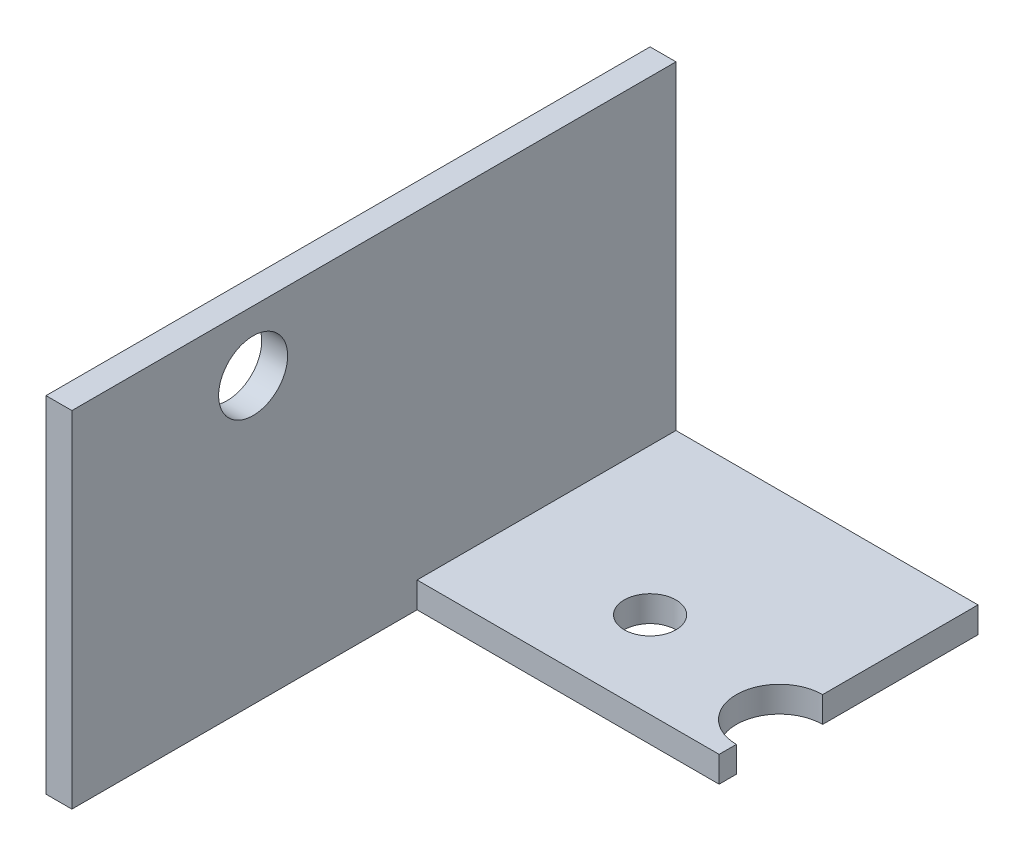
ISO-10303-21;
HEADER;
FILE_DESCRIPTION(('STEP AP214'),'2;1');
FILE_NAME('part.step','',(''),(''),'','','');
FILE_SCHEMA(('AUTOMOTIVE_DESIGN { 1 0 10303 214 1 1 1 1 }'));
ENDSEC;
DATA;
#1=APPLICATION_CONTEXT('core data for automotive mechanical design processes');
#2=APPLICATION_PROTOCOL_DEFINITION('international standard','automotive_design',2000,#1);
#3=PRODUCT_CONTEXT('',#1,'mechanical');
#4=PRODUCT('Part','Part','',(#3));
#5=PRODUCT_RELATED_PRODUCT_CATEGORY('part','',(#4));
#6=PRODUCT_DEFINITION_FORMATION('','',#4);
#7=PRODUCT_DEFINITION_CONTEXT('part definition',#1,'design');
#8=PRODUCT_DEFINITION('design','',#6,#7);
#9=PRODUCT_DEFINITION_SHAPE('','',#8);
#10=(LENGTH_UNIT() NAMED_UNIT(*) SI_UNIT(.MILLI.,.METRE.));
#11=(NAMED_UNIT(*) PLANE_ANGLE_UNIT() SI_UNIT($,.RADIAN.));
#12=(NAMED_UNIT(*) SI_UNIT($,.STERADIAN.) SOLID_ANGLE_UNIT());
#13=UNCERTAINTY_MEASURE_WITH_UNIT(LENGTH_MEASURE(1.E-05),#10,'distance_accuracy_value','');
#14=(GEOMETRIC_REPRESENTATION_CONTEXT(3) GLOBAL_UNCERTAINTY_ASSIGNED_CONTEXT((#13)) GLOBAL_UNIT_ASSIGNED_CONTEXT((#10,
#11,#12)) REPRESENTATION_CONTEXT('',''));
#15=CARTESIAN_POINT('',(0.,0.,0.));
#16=DIRECTION('',(0.,0.,1.));
#17=DIRECTION('',(1.,0.,0.));
#18=AXIS2_PLACEMENT_3D('',#15,#16,#17);
#19=CARTESIAN_POINT('',(5.54541888332214,-10.2268421052632,35.));
#20=DIRECTION('',(-1.,0.,0.));
#21=DIRECTION('',(0.,0.,1.));
#22=AXIS2_PLACEMENT_3D('',#19,#20,#21);
#23=PLANE('',#22);
#24=DIRECTION('',(0.,0.,-1.));
#25=VECTOR('',#24,1.);
#26=CARTESIAN_POINT('',(5.54541888332214,-10.2268421052632,35.));
#27=LINE('',#26,#25);
#28=CARTESIAN_POINT('',(5.54541888332214,-10.2268421052632,15.));
#29=VERTEX_POINT('',#28);
#30=CARTESIAN_POINT('',(5.54541888332214,-10.2268421052632,14.));
#31=VERTEX_POINT('',#30);
#32=EDGE_CURVE('E120',#29,#31,#27,.T.);
#33=ORIENTED_EDGE('',*,*,#32,.T.);
#34=DIRECTION('',(0.,1.,0.));
#35=VECTOR('',#34,1.);
#36=CARTESIAN_POINT('',(5.54541888332214,-25.7268421052632,14.));
#37=LINE('',#36,#35);
#38=CARTESIAN_POINT('',(5.54541888332214,-8.72684210526316,14.));
#39=VERTEX_POINT('',#38);
#40=EDGE_CURVE('E109',#31,#39,#37,.T.);
#41=ORIENTED_EDGE('',*,*,#40,.T.);
#42=DIRECTION('',(0.,0.,-1.));
#43=VECTOR('',#42,1.);
#44=CARTESIAN_POINT('',(5.54541888332214,-8.72684210526316,35.));
#45=LINE('',#44,#43);
#46=CARTESIAN_POINT('',(5.54541888332214,-8.72684210526316,15.));
#47=VERTEX_POINT('',#46);
#48=EDGE_CURVE('E118',#47,#39,#45,.T.);
#49=ORIENTED_EDGE('',*,*,#48,.F.);
#50=DIRECTION('',(0.,1.,0.));
#51=VECTOR('',#50,1.);
#52=CARTESIAN_POINT('',(5.54541888332215,-25.7268421052632,15.));
#53=LINE('',#52,#51);
#54=EDGE_CURVE('E182',#29,#47,#53,.T.);
#55=ORIENTED_EDGE('',*,*,#54,.F.);
#56=EDGE_LOOP('',(#33,#41,#49,#55));
#57=FACE_BOUND('',#56,.T.);
#58=ADVANCED_FACE('F31',(#57),#23,.F.);
#59=CARTESIAN_POINT('',(-11.9545811166779,9.77315789473684,35.));
#60=DIRECTION('',(0.,-1.,0.));
#61=DIRECTION('',(1.,0.,0.));
#62=AXIS2_PLACEMENT_3D('',#59,#60,#61);
#63=PLANE('',#62);
#64=DIRECTION('',(-1.,0.,0.));
#65=VECTOR('',#64,1.);
#66=CARTESIAN_POINT('',(-11.9545811166779,9.77315789473684,0.));
#67=LINE('',#66,#65);
#68=CARTESIAN_POINT('',(-11.9545811166779,9.77315789473684,0.));
#69=VERTEX_POINT('',#68);
#70=CARTESIAN_POINT('',(-13.4545811166779,9.77315789473684,0.));
#71=VERTEX_POINT('',#70);
#72=EDGE_CURVE('E146',#69,#71,#67,.T.);
#73=ORIENTED_EDGE('',*,*,#72,.T.);
#74=DIRECTION('',(0.,0.,-1.));
#75=VECTOR('',#74,1.);
#76=CARTESIAN_POINT('',(-13.4545811166779,9.77315789473684,35.));
#77=LINE('',#76,#75);
#78=CARTESIAN_POINT('',(-13.4545811166779,9.77315789473684,35.));
#79=VERTEX_POINT('',#78);
#80=EDGE_CURVE('E39',#79,#71,#77,.T.);
#81=ORIENTED_EDGE('',*,*,#80,.F.);
#82=DIRECTION('',(-1.,0.,0.));
#83=VECTOR('',#82,1.);
#84=CARTESIAN_POINT('',(-11.9545811166779,9.77315789473684,35.));
#85=LINE('',#84,#83);
#86=CARTESIAN_POINT('',(-11.9545811166779,9.77315789473684,35.));
#87=VERTEX_POINT('',#86);
#88=EDGE_CURVE('E167',#87,#79,#85,.T.);
#89=ORIENTED_EDGE('',*,*,#88,.F.);
#90=DIRECTION('',(0.,0.,-1.));
#91=VECTOR('',#90,1.);
#92=CARTESIAN_POINT('',(-11.9545811166779,9.77315789473684,35.));
#93=LINE('',#92,#91);
#94=EDGE_CURVE('E147',#87,#69,#93,.T.);
#95=ORIENTED_EDGE('',*,*,#94,.T.);
#96=EDGE_LOOP('',(#73,#81,#89,#95));
#97=FACE_BOUND('',#96,.T.);
#98=ADVANCED_FACE('F33',(#97),#63,.F.);
#99=CARTESIAN_POINT('',(-13.4545811166779,9.77315789473684,35.));
#100=DIRECTION('',(1.,0.,0.));
#101=DIRECTION('',(0.,1.,0.));
#102=AXIS2_PLACEMENT_3D('',#99,#100,#101);
#103=PLANE('',#102);
#104=CARTESIAN_POINT('',(-13.4545811166779,6.27315789473685,24.5));
#105=DIRECTION('',(1.,0.,0.));
#106=DIRECTION('',(0.,1.,0.));
#107=AXIS2_PLACEMENT_3D('',#104,#105,#106);
#108=CIRCLE('',#107,2.);
#109=CARTESIAN_POINT('',(-13.4545811166779,8.27315789473685,24.5));
#110=VERTEX_POINT('',#109);
#111=EDGE_CURVE('E149',#110,#110,#108,.T.);
#112=ORIENTED_EDGE('',*,*,#111,.T.);
#113=EDGE_LOOP('',(#112));
#114=FACE_BOUND('',#113,.T.);
#115=DIRECTION('',(0.,-1.,0.));
#116=VECTOR('',#115,1.);
#117=CARTESIAN_POINT('',(-13.4545811166779,9.77315789473684,0.));
#118=LINE('',#117,#116);
#119=CARTESIAN_POINT('',(-13.4545811166779,-10.2268421052632,0.));
#120=VERTEX_POINT('',#119);
#121=EDGE_CURVE('E142',#71,#120,#118,.T.);
#122=ORIENTED_EDGE('',*,*,#121,.T.);
#123=DIRECTION('',(0.,0.,-1.));
#124=VECTOR('',#123,1.);
#125=CARTESIAN_POINT('',(-13.4545811166779,-10.2268421052632,35.));
#126=LINE('',#125,#124);
#127=CARTESIAN_POINT('',(-13.4545811166779,-10.2268421052632,35.));
#128=VERTEX_POINT('',#127);
#129=EDGE_CURVE('E137',#128,#120,#126,.T.);
#130=ORIENTED_EDGE('',*,*,#129,.F.);
#131=DIRECTION('',(0.,-1.,0.));
#132=VECTOR('',#131,1.);
#133=CARTESIAN_POINT('',(-13.4545811166779,9.77315789473684,35.));
#134=LINE('',#133,#132);
#135=EDGE_CURVE('E86',#79,#128,#134,.T.);
#136=ORIENTED_EDGE('',*,*,#135,.F.);
#137=ORIENTED_EDGE('',*,*,#80,.T.);
#138=EDGE_LOOP('',(#122,#130,#136,#137));
#139=FACE_BOUND('',#138,.T.);
#140=ADVANCED_FACE('F141',(#114,#139),#103,.F.);
#141=CARTESIAN_POINT('',(-13.4545811166779,-10.2268421052632,35.));
#142=DIRECTION('',(0.,1.,0.));
#143=DIRECTION('',(0.,0.,1.));
#144=AXIS2_PLACEMENT_3D('',#141,#142,#143);
#145=PLANE('',#144);
#146=CARTESIAN_POINT('',(-3.45458111667786,-10.2268421052632,10.));
#147=DIRECTION('',(0.,1.,0.));
#148=DIRECTION('',(0.,0.,1.));
#149=AXIS2_PLACEMENT_3D('',#146,#147,#148);
#150=CIRCLE('',#149,1.5);
#151=CARTESIAN_POINT('',(-3.45458111667786,-10.2268421052632,11.5));
#152=VERTEX_POINT('',#151);
#153=EDGE_CURVE('E186',#152,#152,#150,.T.);
#154=ORIENTED_EDGE('',*,*,#153,.T.);
#155=EDGE_LOOP('',(#154));
#156=FACE_BOUND('',#155,.T.);
#157=CARTESIAN_POINT('',(5.54541888332214,-10.2268421052632,9.));
#158=VERTEX_POINT('',#157);
#159=CARTESIAN_POINT('',(5.54541888332214,-10.2268421052632,0.));
#160=VERTEX_POINT('',#159);
#161=EDGE_CURVE('E129',#158,#160,#27,.T.);
#162=ORIENTED_EDGE('',*,*,#161,.F.);
#163=CARTESIAN_POINT('',(5.54541888332214,-10.2268421052632,11.5));
#164=DIRECTION('',(0.,1.,0.));
#165=DIRECTION('',(0.,0.,1.));
#166=AXIS2_PLACEMENT_3D('',#163,#164,#165);
#167=CIRCLE('',#166,2.5);
#168=EDGE_CURVE('E122',#158,#31,#167,.T.);
#169=ORIENTED_EDGE('',*,*,#168,.T.);
#170=ORIENTED_EDGE('',*,*,#32,.F.);
#171=DIRECTION('',(-1.,0.,0.));
#172=VECTOR('',#171,1.);
#173=CARTESIAN_POINT('',(-13.4545811166779,-10.2268421052632,15.));
#174=LINE('',#173,#172);
#175=CARTESIAN_POINT('',(-11.9545811166779,-10.2268421052632,15.));
#176=VERTEX_POINT('',#175);
#177=EDGE_CURVE('E175',#29,#176,#174,.T.);
#178=ORIENTED_EDGE('',*,*,#177,.T.);
#179=DIRECTION('',(0.,0.,1.));
#180=VECTOR('',#179,1.);
#181=CARTESIAN_POINT('',(-11.9545811166779,-10.2268421052632,35.));
#182=LINE('',#181,#180);
#183=CARTESIAN_POINT('',(-11.9545811166779,-10.2268421052632,35.));
#184=VERTEX_POINT('',#183);
#185=EDGE_CURVE('E178',#176,#184,#182,.T.);
#186=ORIENTED_EDGE('',*,*,#185,.T.);
#187=DIRECTION('',(1.,0.,0.));
#188=VECTOR('',#187,1.);
#189=CARTESIAN_POINT('',(-13.4545811166779,-10.2268421052632,35.));
#190=LINE('',#189,#188);
#191=EDGE_CURVE('E168',#128,#184,#190,.T.);
#192=ORIENTED_EDGE('',*,*,#191,.F.);
#193=ORIENTED_EDGE('',*,*,#129,.T.);
#194=DIRECTION('',(1.,0.,0.));
#195=VECTOR('',#194,1.);
#196=CARTESIAN_POINT('',(-13.4545811166779,-10.2268421052632,0.));
#197=LINE('',#196,#195);
#198=EDGE_CURVE('E151',#120,#160,#197,.T.);
#199=ORIENTED_EDGE('',*,*,#198,.T.);
#200=EDGE_LOOP('',(#162,#169,#170,#178,#186,#192,#193,#199));
#201=FACE_BOUND('',#200,.T.);
#202=ADVANCED_FACE('F196',(#156,#201),#145,.F.);
#203=CARTESIAN_POINT('',(5.54541888332214,-8.72684210526316,9.));
#204=VERTEX_POINT('',#203);
#205=CARTESIAN_POINT('',(5.54541888332214,-8.72684210526316,0.));
#206=VERTEX_POINT('',#205);
#207=EDGE_CURVE('E130',#204,#206,#45,.T.);
#208=ORIENTED_EDGE('',*,*,#207,.F.);
#209=DIRECTION('',(0.,1.,0.));
#210=VECTOR('',#209,1.);
#211=CARTESIAN_POINT('',(5.54541888332214,-25.7268421052632,9.));
#212=LINE('',#211,#210);
#213=EDGE_CURVE('E46',#204,#158,#212,.F.);
#214=ORIENTED_EDGE('',*,*,#213,.T.);
#215=ORIENTED_EDGE('',*,*,#161,.T.);
#216=DIRECTION('',(0.,1.,0.));
#217=VECTOR('',#216,1.);
#218=CARTESIAN_POINT('',(5.54541888332214,-10.2268421052632,0.));
#219=LINE('',#218,#217);
#220=EDGE_CURVE('E161',#160,#206,#219,.T.);
#221=ORIENTED_EDGE('',*,*,#220,.T.);
#222=EDGE_LOOP('',(#208,#214,#215,#221));
#223=FACE_BOUND('',#222,.T.);
#224=ADVANCED_FACE('F194',(#223),#23,.F.);
#225=CARTESIAN_POINT('',(5.54541888332214,-8.72684210526316,35.));
#226=DIRECTION('',(0.,-1.,0.));
#227=DIRECTION('',(1.,0.,0.));
#228=AXIS2_PLACEMENT_3D('',#225,#226,#227);
#229=PLANE('',#228);
#230=CARTESIAN_POINT('',(-3.45458111667786,-8.72684210526316,10.));
#231=DIRECTION('',(0.,1.,0.));
#232=DIRECTION('',(-1.,0.,0.));
#233=AXIS2_PLACEMENT_3D('',#230,#231,#232);
#234=CIRCLE('',#233,1.5);
#235=CARTESIAN_POINT('',(-4.95458111667786,-8.72684210526316,10.));
#236=VERTEX_POINT('',#235);
#237=EDGE_CURVE('E121',#236,#236,#234,.T.);
#238=ORIENTED_EDGE('',*,*,#237,.F.);
#239=EDGE_LOOP('',(#238));
#240=FACE_BOUND('',#239,.T.);
#241=ORIENTED_EDGE('',*,*,#48,.T.);
#242=CARTESIAN_POINT('',(5.54541888332214,-8.72684210526316,11.5));
#243=DIRECTION('',(0.,-1.,0.));
#244=DIRECTION('',(1.,0.,0.));
#245=AXIS2_PLACEMENT_3D('',#242,#243,#244);
#246=CIRCLE('',#245,2.5);
#247=EDGE_CURVE('E11',#39,#204,#246,.T.);
#248=ORIENTED_EDGE('',*,*,#247,.T.);
#249=ORIENTED_EDGE('',*,*,#207,.T.);
#250=DIRECTION('',(-1.,0.,0.));
#251=VECTOR('',#250,1.);
#252=CARTESIAN_POINT('',(5.54541888332214,-8.72684210526316,0.));
#253=LINE('',#252,#251);
#254=CARTESIAN_POINT('',(-11.9545811166779,-8.72684210526316,0.));
#255=VERTEX_POINT('',#254);
#256=EDGE_CURVE('E164',#206,#255,#253,.T.);
#257=ORIENTED_EDGE('',*,*,#256,.T.);
#258=DIRECTION('',(0.,0.,-1.));
#259=VECTOR('',#258,1.);
#260=CARTESIAN_POINT('',(-11.9545811166779,-8.72684210526316,35.));
#261=LINE('',#260,#259);
#262=CARTESIAN_POINT('',(-11.9545811166779,-8.72684210526316,15.));
#263=VERTEX_POINT('',#262);
#264=EDGE_CURVE('E133',#263,#255,#261,.T.);
#265=ORIENTED_EDGE('',*,*,#264,.F.);
#266=DIRECTION('',(-1.,0.,0.));
#267=VECTOR('',#266,1.);
#268=CARTESIAN_POINT('',(5.54541888332214,-8.72684210526316,15.));
#269=LINE('',#268,#267);
#270=EDGE_CURVE('E128',#47,#263,#269,.T.);
#271=ORIENTED_EDGE('',*,*,#270,.F.);
#272=EDGE_LOOP('',(#241,#248,#249,#257,#265,#271));
#273=FACE_BOUND('',#272,.T.);
#274=ADVANCED_FACE('F125',(#240,#273),#229,.F.);
#275=CARTESIAN_POINT('',(-11.9545811166779,-8.72684210526316,35.));
#276=DIRECTION('',(-1.,0.,0.));
#277=DIRECTION('',(0.,-1.,0.));
#278=AXIS2_PLACEMENT_3D('',#275,#276,#277);
#279=PLANE('',#278);
#280=CARTESIAN_POINT('',(-11.9545811166779,6.27315789473685,24.5));
#281=DIRECTION('',(1.,0.,0.));
#282=DIRECTION('',(0.,1.,0.));
#283=AXIS2_PLACEMENT_3D('',#280,#281,#282);
#284=CIRCLE('',#283,2.);
#285=CARTESIAN_POINT('',(-11.9545811166779,8.27315789473685,24.5));
#286=VERTEX_POINT('',#285);
#287=EDGE_CURVE('E154',#286,#286,#284,.T.);
#288=ORIENTED_EDGE('',*,*,#287,.F.);
#289=EDGE_LOOP('',(#288));
#290=FACE_BOUND('',#289,.T.);
#291=DIRECTION('',(0.,1.,0.));
#292=VECTOR('',#291,1.);
#293=CARTESIAN_POINT('',(-11.9545811166779,-8.72684210526316,0.));
#294=LINE('',#293,#292);
#295=EDGE_CURVE('E80',#255,#69,#294,.T.);
#296=ORIENTED_EDGE('',*,*,#295,.T.);
#297=ORIENTED_EDGE('',*,*,#94,.F.);
#298=DIRECTION('',(0.,1.,0.));
#299=VECTOR('',#298,1.);
#300=CARTESIAN_POINT('',(-11.9545811166779,-8.72684210526316,35.));
#301=LINE('',#300,#299);
#302=EDGE_CURVE('E54',#184,#87,#301,.T.);
#303=ORIENTED_EDGE('',*,*,#302,.F.);
#304=ORIENTED_EDGE('',*,*,#185,.F.);
#305=DIRECTION('',(0.,1.,0.));
#306=VECTOR('',#305,1.);
#307=CARTESIAN_POINT('',(-11.9545811166779,-25.7268421052632,15.));
#308=LINE('',#307,#306);
#309=EDGE_CURVE('E181',#176,#263,#308,.T.);
#310=ORIENTED_EDGE('',*,*,#309,.T.);
#311=ORIENTED_EDGE('',*,*,#264,.T.);
#312=EDGE_LOOP('',(#296,#297,#303,#304,#310,#311));
#313=FACE_BOUND('',#312,.T.);
#314=ADVANCED_FACE('F201',(#290,#313),#279,.F.);
#315=CARTESIAN_POINT('',(-13.4545811166779,9.77315789473684,35.));
#316=DIRECTION('',(0.,0.,1.));
#317=DIRECTION('',(1.,0.,0.));
#318=AXIS2_PLACEMENT_3D('',#315,#316,#317);
#319=PLANE('',#318);
#320=ORIENTED_EDGE('',*,*,#191,.T.);
#321=ORIENTED_EDGE('',*,*,#302,.T.);
#322=ORIENTED_EDGE('',*,*,#88,.T.);
#323=ORIENTED_EDGE('',*,*,#135,.T.);
#324=EDGE_LOOP('',(#320,#321,#322,#323));
#325=FACE_BOUND('',#324,.T.);
#326=ADVANCED_FACE('F254',(#325),#319,.T.);
#327=CARTESIAN_POINT('',(-13.4545811166779,9.77315789473684,0.));
#328=DIRECTION('',(0.,0.,1.));
#329=DIRECTION('',(1.,0.,0.));
#330=AXIS2_PLACEMENT_3D('',#327,#328,#329);
#331=PLANE('',#330);
#332=ORIENTED_EDGE('',*,*,#72,.F.);
#333=ORIENTED_EDGE('',*,*,#295,.F.);
#334=ORIENTED_EDGE('',*,*,#256,.F.);
#335=ORIENTED_EDGE('',*,*,#220,.F.);
#336=ORIENTED_EDGE('',*,*,#198,.F.);
#337=ORIENTED_EDGE('',*,*,#121,.F.);
#338=EDGE_LOOP('',(#332,#333,#334,#335,#336,#337));
#339=FACE_BOUND('',#338,.T.);
#340=ADVANCED_FACE('F200',(#339),#331,.F.);
#341=CARTESIAN_POINT('',(-28.9545811166779,6.27315789473685,24.5));
#342=DIRECTION('',(1.,0.,0.));
#343=DIRECTION('',(0.,1.,0.));
#344=AXIS2_PLACEMENT_3D('',#341,#342,#343);
#345=CYLINDRICAL_SURFACE('',#344,2.);
#346=ORIENTED_EDGE('',*,*,#287,.T.);
#347=EDGE_LOOP('',(#346));
#348=FACE_BOUND('',#347,.T.);
#349=ORIENTED_EDGE('',*,*,#111,.F.);
#350=EDGE_LOOP('',(#349));
#351=FACE_BOUND('',#350,.T.);
#352=ADVANCED_FACE('F207',(#348,#351),#345,.F.);
#353=CARTESIAN_POINT('',(5.54541888332215,-25.7268421052632,15.));
#354=DIRECTION('',(0.,0.,-1.));
#355=DIRECTION('',(-1.,0.,0.));
#356=AXIS2_PLACEMENT_3D('',#353,#354,#355);
#357=PLANE('',#356);
#358=ORIENTED_EDGE('',*,*,#54,.T.);
#359=ORIENTED_EDGE('',*,*,#270,.T.);
#360=ORIENTED_EDGE('',*,*,#309,.F.);
#361=ORIENTED_EDGE('',*,*,#177,.F.);
#362=EDGE_LOOP('',(#358,#359,#360,#361));
#363=FACE_BOUND('',#362,.T.);
#364=ADVANCED_FACE('F204',(#363),#357,.F.);
#365=CARTESIAN_POINT('',(-3.45458111667786,-25.7268421052632,10.));
#366=DIRECTION('',(0.,1.,0.));
#367=DIRECTION('',(-1.,0.,0.));
#368=AXIS2_PLACEMENT_3D('',#365,#366,#367);
#369=CYLINDRICAL_SURFACE('',#368,1.5);
#370=ORIENTED_EDGE('',*,*,#237,.T.);
#371=EDGE_LOOP('',(#370));
#372=FACE_BOUND('',#371,.T.);
#373=ORIENTED_EDGE('',*,*,#153,.F.);
#374=EDGE_LOOP('',(#373));
#375=FACE_BOUND('',#374,.T.);
#376=ADVANCED_FACE('F206',(#372,#375),#369,.F.);
#377=CARTESIAN_POINT('',(5.54541888332215,-25.7268421052632,11.5));
#378=DIRECTION('',(0.,1.,0.));
#379=DIRECTION('',(-1.,0.,0.));
#380=AXIS2_PLACEMENT_3D('',#377,#378,#379);
#381=CYLINDRICAL_SURFACE('',#380,2.5);
#382=ORIENTED_EDGE('',*,*,#168,.F.);
#383=ORIENTED_EDGE('',*,*,#213,.F.);
#384=ORIENTED_EDGE('',*,*,#247,.F.);
#385=ORIENTED_EDGE('',*,*,#40,.F.);
#386=EDGE_LOOP('',(#382,#383,#384,#385));
#387=FACE_BOUND('',#386,.T.);
#388=ADVANCED_FACE('F108',(#387),#381,.F.);
#389=CLOSED_SHELL('',(#58,#98,#140,#202,#224,#274,#314,#326,#340,#352,#364,#376,#388));
#390=MANIFOLD_SOLID_BREP('B2',#389);
#391=ADVANCED_BREP_SHAPE_REPRESENTATION('',(#18,#390),#14);
#392=SHAPE_DEFINITION_REPRESENTATION(#9,#391);
ENDSEC;
END-ISO-10303-21;
